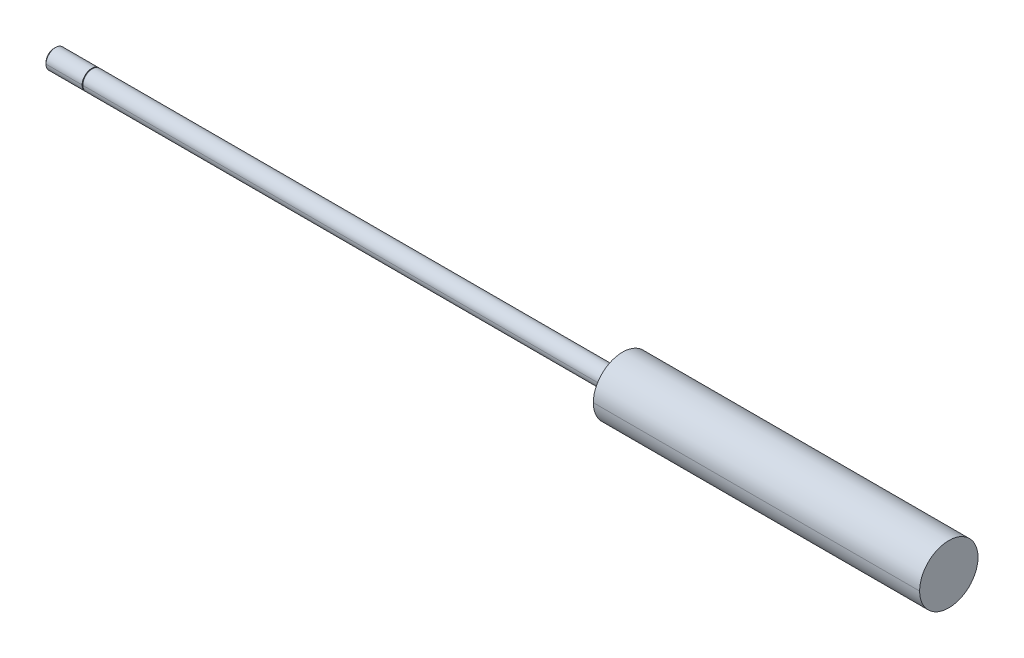
ISO-10303-21;
HEADER;
FILE_DESCRIPTION(('STEP AP214'),'2;1');
FILE_NAME('part.step','',(''),(''),'','','');
FILE_SCHEMA(('AUTOMOTIVE_DESIGN { 1 0 10303 214 1 1 1 1 }'));
ENDSEC;
DATA;
#1=APPLICATION_CONTEXT('core data for automotive mechanical design processes');
#2=APPLICATION_PROTOCOL_DEFINITION('international standard','automotive_design',2000,#1);
#3=PRODUCT_CONTEXT('',#1,'mechanical');
#4=PRODUCT('Part','Part','',(#3));
#5=PRODUCT_RELATED_PRODUCT_CATEGORY('part','',(#4));
#6=PRODUCT_DEFINITION_FORMATION('','',#4);
#7=PRODUCT_DEFINITION_CONTEXT('part definition',#1,'design');
#8=PRODUCT_DEFINITION('design','',#6,#7);
#9=PRODUCT_DEFINITION_SHAPE('','',#8);
#10=(LENGTH_UNIT() NAMED_UNIT(*) SI_UNIT(.MILLI.,.METRE.));
#11=(NAMED_UNIT(*) PLANE_ANGLE_UNIT() SI_UNIT($,.RADIAN.));
#12=(NAMED_UNIT(*) SI_UNIT($,.STERADIAN.) SOLID_ANGLE_UNIT());
#13=UNCERTAINTY_MEASURE_WITH_UNIT(LENGTH_MEASURE(1.E-05),#10,'distance_accuracy_value','');
#14=(GEOMETRIC_REPRESENTATION_CONTEXT(3) GLOBAL_UNCERTAINTY_ASSIGNED_CONTEXT((#13)) GLOBAL_UNIT_ASSIGNED_CONTEXT((#10,
#11,#12)) REPRESENTATION_CONTEXT('',''));
#15=CARTESIAN_POINT('',(0.,0.,0.));
#16=DIRECTION('',(0.,0.,1.));
#17=DIRECTION('',(1.,0.,0.));
#18=AXIS2_PLACEMENT_3D('',#15,#16,#17);
#19=CARTESIAN_POINT('',(0.,0.,0.));
#20=DIRECTION('',(-1.,0.,0.));
#21=DIRECTION('',(0.,-1.,0.));
#22=AXIS2_PLACEMENT_3D('',#19,#20,#21);
#23=CYLINDRICAL_SURFACE('',#22,2.921);
#24=CARTESIAN_POINT('',(0.,0.,0.));
#25=DIRECTION('',(1.,0.,0.));
#26=DIRECTION('',(0.,0.,-1.));
#27=AXIS2_PLACEMENT_3D('',#24,#25,#26);
#28=CIRCLE('',#27,2.921);
#29=CARTESIAN_POINT('',(0.,0.,-2.921));
#30=VERTEX_POINT('',#29);
#31=CARTESIAN_POINT('',(0.,0.,2.921));
#32=VERTEX_POINT('',#31);
#33=EDGE_CURVE('E11',#30,#32,#28,.T.);
#34=ORIENTED_EDGE('',*,*,#33,.F.);
#35=DIRECTION('',(-1.,0.,0.));
#36=VECTOR('',#35,1.);
#37=CARTESIAN_POINT('',(0.,0.,-2.921));
#38=LINE('',#37,#36);
#39=CARTESIAN_POINT('',(-0.254,0.,-2.921));
#40=VERTEX_POINT('',#39);
#41=EDGE_CURVE('E25',#30,#40,#38,.T.);
#42=ORIENTED_EDGE('',*,*,#41,.T.);
#43=CARTESIAN_POINT('',(-0.254,0.,0.));
#44=DIRECTION('',(1.,0.,0.));
#45=DIRECTION('',(0.,0.,-1.));
#46=AXIS2_PLACEMENT_3D('',#43,#44,#45);
#47=CIRCLE('',#46,2.921);
#48=CARTESIAN_POINT('',(-0.254,0.,2.921));
#49=VERTEX_POINT('',#48);
#50=EDGE_CURVE('E211',#40,#49,#47,.T.);
#51=ORIENTED_EDGE('',*,*,#50,.T.);
#52=DIRECTION('',(-1.,0.,0.));
#53=VECTOR('',#52,1.);
#54=CARTESIAN_POINT('',(0.,0.,2.921));
#55=LINE('',#54,#53);
#56=EDGE_CURVE('E206',#32,#49,#55,.T.);
#57=ORIENTED_EDGE('',*,*,#56,.F.);
#58=EDGE_LOOP('',(#34,#42,#51,#57));
#59=FACE_BOUND('',#58,.T.);
#60=ADVANCED_FACE('F17',(#59),#23,.T.);
#61=CARTESIAN_POINT('',(0.,0.,0.));
#62=DIRECTION('',(-1.,0.,0.));
#63=DIRECTION('',(0.,1.,0.));
#64=AXIS2_PLACEMENT_3D('',#61,#62,#63);
#65=CYLINDRICAL_SURFACE('',#64,2.921);
#66=CARTESIAN_POINT('',(-0.254,0.,0.));
#67=DIRECTION('',(1.,0.,0.));
#68=DIRECTION('',(0.,0.,-1.));
#69=AXIS2_PLACEMENT_3D('',#66,#67,#68);
#70=CIRCLE('',#69,2.921);
#71=EDGE_CURVE('E202',#49,#40,#70,.T.);
#72=ORIENTED_EDGE('',*,*,#71,.T.);
#73=ORIENTED_EDGE('',*,*,#41,.F.);
#74=CARTESIAN_POINT('',(0.,0.,0.));
#75=DIRECTION('',(1.,0.,0.));
#76=DIRECTION('',(0.,0.,-1.));
#77=AXIS2_PLACEMENT_3D('',#74,#75,#76);
#78=CIRCLE('',#77,2.921);
#79=EDGE_CURVE('E197',#32,#30,#78,.T.);
#80=ORIENTED_EDGE('',*,*,#79,.F.);
#81=ORIENTED_EDGE('',*,*,#56,.T.);
#82=EDGE_LOOP('',(#72,#73,#80,#81));
#83=FACE_BOUND('',#82,.T.);
#84=ADVANCED_FACE('F224',(#83),#65,.T.);
#85=CARTESIAN_POINT('',(0.,2.921,0.));
#86=DIRECTION('',(1.,0.,0.));
#87=DIRECTION('',(0.,0.,-1.));
#88=AXIS2_PLACEMENT_3D('',#85,#86,#87);
#89=PLANE('',#88);
#90=CARTESIAN_POINT('',(0.,0.,0.));
#91=DIRECTION('',(1.,0.,0.));
#92=DIRECTION('',(0.,0.,-1.));
#93=AXIS2_PLACEMENT_3D('',#90,#91,#92);
#94=CIRCLE('',#93,3.175);
#95=CARTESIAN_POINT('',(0.,0.,-3.175));
#96=VERTEX_POINT('',#95);
#97=CARTESIAN_POINT('',(0.,0.,3.175));
#98=VERTEX_POINT('',#97);
#99=EDGE_CURVE('E192',#96,#98,#94,.T.);
#100=ORIENTED_EDGE('',*,*,#99,.F.);
#101=CARTESIAN_POINT('',(0.,0.,0.));
#102=DIRECTION('',(1.,0.,0.));
#103=DIRECTION('',(0.,0.,-1.));
#104=AXIS2_PLACEMENT_3D('',#101,#102,#103);
#105=CIRCLE('',#104,3.175);
#106=EDGE_CURVE('E187',#98,#96,#105,.T.);
#107=ORIENTED_EDGE('',*,*,#106,.F.);
#108=EDGE_LOOP('',(#100,#107));
#109=FACE_BOUND('',#108,.T.);
#110=ORIENTED_EDGE('',*,*,#33,.T.);
#111=ORIENTED_EDGE('',*,*,#79,.T.);
#112=EDGE_LOOP('',(#110,#111));
#113=FACE_BOUND('',#112,.T.);
#114=ADVANCED_FACE('F249',(#109,#113),#89,.F.);
#115=CARTESIAN_POINT('',(282.1432,0.,0.));
#116=DIRECTION('',(-1.,0.,0.));
#117=DIRECTION('',(0.,1.,0.));
#118=AXIS2_PLACEMENT_3D('',#115,#116,#117);
#119=CYLINDRICAL_SURFACE('',#118,3.175);
#120=ORIENTED_EDGE('',*,*,#106,.T.);
#121=DIRECTION('',(-1.,0.,0.));
#122=VECTOR('',#121,1.);
#123=CARTESIAN_POINT('',(174.625,0.,-3.175));
#124=LINE('',#123,#122);
#125=CARTESIAN_POINT('',(174.625,0.,-3.175));
#126=VERTEX_POINT('',#125);
#127=EDGE_CURVE('E182',#126,#96,#124,.T.);
#128=ORIENTED_EDGE('',*,*,#127,.F.);
#129=CARTESIAN_POINT('',(174.625,0.,0.));
#130=DIRECTION('',(1.,0.,0.));
#131=DIRECTION('',(0.,0.,-1.));
#132=AXIS2_PLACEMENT_3D('',#129,#130,#131);
#133=CIRCLE('',#132,3.175);
#134=CARTESIAN_POINT('',(174.625,0.,3.175));
#135=VERTEX_POINT('',#134);
#136=EDGE_CURVE('E177',#135,#126,#133,.T.);
#137=ORIENTED_EDGE('',*,*,#136,.F.);
#138=DIRECTION('',(-1.,0.,0.));
#139=VECTOR('',#138,1.);
#140=CARTESIAN_POINT('',(174.625,0.,3.175));
#141=LINE('',#140,#139);
#142=EDGE_CURVE('E172',#135,#98,#141,.T.);
#143=ORIENTED_EDGE('',*,*,#142,.T.);
#144=EDGE_LOOP('',(#120,#128,#137,#143));
#145=FACE_BOUND('',#144,.T.);
#146=ADVANCED_FACE('F253',(#145),#119,.T.);
#147=CARTESIAN_POINT('',(282.1432,0.,0.));
#148=DIRECTION('',(-1.,0.,0.));
#149=DIRECTION('',(0.,-1.,0.));
#150=AXIS2_PLACEMENT_3D('',#147,#148,#149);
#151=CYLINDRICAL_SURFACE('',#150,3.175);
#152=CARTESIAN_POINT('',(174.625,0.,0.));
#153=DIRECTION('',(1.,0.,0.));
#154=DIRECTION('',(0.,0.,-1.));
#155=AXIS2_PLACEMENT_3D('',#152,#153,#154);
#156=CIRCLE('',#155,3.175);
#157=EDGE_CURVE('E167',#126,#135,#156,.T.);
#158=ORIENTED_EDGE('',*,*,#157,.F.);
#159=ORIENTED_EDGE('',*,*,#127,.T.);
#160=ORIENTED_EDGE('',*,*,#99,.T.);
#161=ORIENTED_EDGE('',*,*,#142,.F.);
#162=EDGE_LOOP('',(#158,#159,#160,#161));
#163=FACE_BOUND('',#162,.T.);
#164=ADVANCED_FACE('F259',(#163),#151,.T.);
#165=CARTESIAN_POINT('',(174.625,3.175,0.));
#166=DIRECTION('',(1.,0.,0.));
#167=DIRECTION('',(0.,0.,-1.));
#168=AXIS2_PLACEMENT_3D('',#165,#166,#167);
#169=PLANE('',#168);
#170=CARTESIAN_POINT('',(174.625,0.,0.));
#171=DIRECTION('',(1.,0.,0.));
#172=DIRECTION('',(0.,0.,-1.));
#173=AXIS2_PLACEMENT_3D('',#170,#171,#172);
#174=CIRCLE('',#173,9.62025);
#175=CARTESIAN_POINT('',(174.625,0.,-9.62025));
#176=VERTEX_POINT('',#175);
#177=CARTESIAN_POINT('',(174.625,0.,9.62025));
#178=VERTEX_POINT('',#177);
#179=EDGE_CURVE('E162',#176,#178,#174,.T.);
#180=ORIENTED_EDGE('',*,*,#179,.F.);
#181=CARTESIAN_POINT('',(174.625,0.,0.));
#182=DIRECTION('',(1.,0.,0.));
#183=DIRECTION('',(0.,0.,-1.));
#184=AXIS2_PLACEMENT_3D('',#181,#182,#183);
#185=CIRCLE('',#184,9.62025);
#186=EDGE_CURVE('E157',#178,#176,#185,.T.);
#187=ORIENTED_EDGE('',*,*,#186,.F.);
#188=EDGE_LOOP('',(#180,#187));
#189=FACE_BOUND('',#188,.T.);
#190=ORIENTED_EDGE('',*,*,#157,.T.);
#191=ORIENTED_EDGE('',*,*,#136,.T.);
#192=EDGE_LOOP('',(#190,#191));
#193=FACE_BOUND('',#192,.T.);
#194=ADVANCED_FACE('F263',(#189,#193),#169,.F.);
#195=CARTESIAN_POINT('',(282.1432,0.,0.));
#196=DIRECTION('',(-1.,0.,0.));
#197=DIRECTION('',(0.,1.,0.));
#198=AXIS2_PLACEMENT_3D('',#195,#196,#197);
#199=CYLINDRICAL_SURFACE('',#198,9.62025);
#200=ORIENTED_EDGE('',*,*,#186,.T.);
#201=DIRECTION('',(-1.,0.,0.));
#202=VECTOR('',#201,1.);
#203=CARTESIAN_POINT('',(282.1432,0.,-9.62025));
#204=LINE('',#203,#202);
#205=CARTESIAN_POINT('',(282.1432,0.,-9.62025));
#206=VERTEX_POINT('',#205);
#207=EDGE_CURVE('E152',#206,#176,#204,.T.);
#208=ORIENTED_EDGE('',*,*,#207,.F.);
#209=CARTESIAN_POINT('',(282.1432,0.,0.));
#210=DIRECTION('',(1.,0.,0.));
#211=DIRECTION('',(0.,0.,-1.));
#212=AXIS2_PLACEMENT_3D('',#209,#210,#211);
#213=CIRCLE('',#212,9.62025);
#214=CARTESIAN_POINT('',(282.1432,0.,9.62025));
#215=VERTEX_POINT('',#214);
#216=EDGE_CURVE('E147',#215,#206,#213,.T.);
#217=ORIENTED_EDGE('',*,*,#216,.F.);
#218=DIRECTION('',(-1.,0.,0.));
#219=VECTOR('',#218,1.);
#220=CARTESIAN_POINT('',(282.1432,0.,9.62025));
#221=LINE('',#220,#219);
#222=EDGE_CURVE('E142',#215,#178,#221,.T.);
#223=ORIENTED_EDGE('',*,*,#222,.T.);
#224=EDGE_LOOP('',(#200,#208,#217,#223));
#225=FACE_BOUND('',#224,.T.);
#226=ADVANCED_FACE('F267',(#225),#199,.T.);
#227=CARTESIAN_POINT('',(282.1432,0.,0.));
#228=DIRECTION('',(-1.,0.,0.));
#229=DIRECTION('',(0.,-1.,0.));
#230=AXIS2_PLACEMENT_3D('',#227,#228,#229);
#231=CYLINDRICAL_SURFACE('',#230,9.62025);
#232=CARTESIAN_POINT('',(282.1432,0.,0.));
#233=DIRECTION('',(1.,0.,0.));
#234=DIRECTION('',(0.,0.,-1.));
#235=AXIS2_PLACEMENT_3D('',#232,#233,#234);
#236=CIRCLE('',#235,9.62025);
#237=EDGE_CURVE('E137',#206,#215,#236,.T.);
#238=ORIENTED_EDGE('',*,*,#237,.F.);
#239=ORIENTED_EDGE('',*,*,#207,.T.);
#240=ORIENTED_EDGE('',*,*,#179,.T.);
#241=ORIENTED_EDGE('',*,*,#222,.F.);
#242=EDGE_LOOP('',(#238,#239,#240,#241));
#243=FACE_BOUND('',#242,.T.);
#244=ADVANCED_FACE('F271',(#243),#231,.T.);
#245=CARTESIAN_POINT('',(282.1432,9.62025,0.));
#246=DIRECTION('',(-1.,0.,0.));
#247=DIRECTION('',(0.,0.,1.));
#248=AXIS2_PLACEMENT_3D('',#245,#246,#247);
#249=PLANE('',#248);
#250=ORIENTED_EDGE('',*,*,#237,.T.);
#251=ORIENTED_EDGE('',*,*,#216,.T.);
#252=EDGE_LOOP('',(#250,#251));
#253=FACE_BOUND('',#252,.T.);
#254=ADVANCED_FACE('F229',(#253),#249,.F.);
#255=CARTESIAN_POINT('',(-0.254,3.429,0.));
#256=DIRECTION('',(-1.,0.,0.));
#257=DIRECTION('',(0.,0.,1.));
#258=AXIS2_PLACEMENT_3D('',#255,#256,#257);
#259=PLANE('',#258);
#260=ORIENTED_EDGE('',*,*,#50,.F.);
#261=ORIENTED_EDGE('',*,*,#71,.F.);
#262=EDGE_LOOP('',(#260,#261));
#263=FACE_BOUND('',#262,.T.);
#264=CARTESIAN_POINT('',(-0.253999999999976,0.,0.));
#265=DIRECTION('',(-1.,0.,0.));
#266=DIRECTION('',(0.,0.,1.));
#267=AXIS2_PLACEMENT_3D('',#264,#265,#266);
#268=CIRCLE('',#267,3.175);
#269=CARTESIAN_POINT('',(-0.253999999999976,0.,3.175));
#270=VERTEX_POINT('',#269);
#271=CARTESIAN_POINT('',(-0.253999999999962,0.,-3.175));
#272=VERTEX_POINT('',#271);
#273=EDGE_CURVE('E132',#270,#272,#268,.T.);
#274=ORIENTED_EDGE('',*,*,#273,.F.);
#275=CARTESIAN_POINT('',(-0.253999999999976,0.,0.));
#276=DIRECTION('',(-1.,0.,0.));
#277=DIRECTION('',(0.,0.,1.));
#278=AXIS2_PLACEMENT_3D('',#275,#276,#277);
#279=CIRCLE('',#278,3.175);
#280=EDGE_CURVE('E127',#272,#270,#279,.T.);
#281=ORIENTED_EDGE('',*,*,#280,.F.);
#282=EDGE_LOOP('',(#274,#281));
#283=FACE_BOUND('',#282,.T.);
#284=ADVANCED_FACE('F225',(#263,#283),#259,.F.);
#285=CARTESIAN_POINT('',(282.1432,0.,0.));
#286=DIRECTION('',(-1.,0.,0.));
#287=DIRECTION('',(0.,1.,0.));
#288=AXIS2_PLACEMENT_3D('',#285,#286,#287);
#289=CYLINDRICAL_SURFACE('',#288,3.175);
#290=CARTESIAN_POINT('',(-12.15898,0.,0.));
#291=DIRECTION('',(1.,0.,0.));
#292=DIRECTION('',(0.,0.,-1.));
#293=AXIS2_PLACEMENT_3D('',#290,#291,#292);
#294=CIRCLE('',#293,3.175);
#295=CARTESIAN_POINT('',(-12.15898,0.,3.175));
#296=VERTEX_POINT('',#295);
#297=CARTESIAN_POINT('',(-12.15898,0.,-3.175));
#298=VERTEX_POINT('',#297);
#299=EDGE_CURVE('E98',#296,#298,#294,.T.);
#300=ORIENTED_EDGE('',*,*,#299,.T.);
#301=DIRECTION('',(-1.,0.,0.));
#302=VECTOR('',#301,1.);
#303=CARTESIAN_POINT('',(-0.253999999999962,0.,-3.175));
#304=LINE('',#303,#302);
#305=EDGE_CURVE('E119',#272,#298,#304,.T.);
#306=ORIENTED_EDGE('',*,*,#305,.F.);
#307=ORIENTED_EDGE('',*,*,#280,.T.);
#308=DIRECTION('',(-1.,0.,0.));
#309=VECTOR('',#308,1.);
#310=CARTESIAN_POINT('',(-0.253999999999962,0.,3.175));
#311=LINE('',#310,#309);
#312=EDGE_CURVE('E115',#270,#296,#311,.T.);
#313=ORIENTED_EDGE('',*,*,#312,.T.);
#314=EDGE_LOOP('',(#300,#306,#307,#313));
#315=FACE_BOUND('',#314,.T.);
#316=ADVANCED_FACE('F228',(#315),#289,.T.);
#317=CARTESIAN_POINT('',(282.1432,0.,0.));
#318=DIRECTION('',(-1.,0.,0.));
#319=DIRECTION('',(0.,-1.,0.));
#320=AXIS2_PLACEMENT_3D('',#317,#318,#319);
#321=CYLINDRICAL_SURFACE('',#320,3.175);
#322=ORIENTED_EDGE('',*,*,#273,.T.);
#323=ORIENTED_EDGE('',*,*,#305,.T.);
#324=CARTESIAN_POINT('',(-12.15898,0.,0.));
#325=DIRECTION('',(1.,0.,0.));
#326=DIRECTION('',(0.,0.,-1.));
#327=AXIS2_PLACEMENT_3D('',#324,#325,#326);
#328=CIRCLE('',#327,3.175);
#329=EDGE_CURVE('E110',#298,#296,#328,.T.);
#330=ORIENTED_EDGE('',*,*,#329,.T.);
#331=ORIENTED_EDGE('',*,*,#312,.F.);
#332=EDGE_LOOP('',(#322,#323,#330,#331));
#333=FACE_BOUND('',#332,.T.);
#334=ADVANCED_FACE('F235',(#333),#321,.T.);
#335=CARTESIAN_POINT('',(-12.7,0.,0.));
#336=DIRECTION('',(1.,0.,0.));
#337=DIRECTION('',(0.,-1.,0.));
#338=AXIS2_PLACEMENT_3D('',#335,#336,#337);
#339=CONICAL_SURFACE('',#338,2.63398,0.7853981634);
#340=ORIENTED_EDGE('',*,*,#329,.F.);
#341=DIRECTION('',(0.707106781184742,0.,-0.707106781188353));
#342=VECTOR('',#341,1.);
#343=CARTESIAN_POINT('',(-12.7,0.,-2.63398));
#344=LINE('',#343,#342);
#345=CARTESIAN_POINT('',(-12.7,0.,-2.63398));
#346=VERTEX_POINT('',#345);
#347=EDGE_CURVE('E90',#346,#298,#344,.T.);
#348=ORIENTED_EDGE('',*,*,#347,.F.);
#349=CARTESIAN_POINT('',(-12.7,0.,0.));
#350=DIRECTION('',(1.,0.,0.));
#351=DIRECTION('',(0.,0.,-1.));
#352=AXIS2_PLACEMENT_3D('',#349,#350,#351);
#353=CIRCLE('',#352,2.63398);
#354=CARTESIAN_POINT('',(-12.7,0.,2.63398));
#355=VERTEX_POINT('',#354);
#356=EDGE_CURVE('E83',#346,#355,#353,.T.);
#357=ORIENTED_EDGE('',*,*,#356,.T.);
#358=DIRECTION('',(0.707106781184742,0.,0.707106781188353));
#359=VECTOR('',#358,1.);
#360=CARTESIAN_POINT('',(-12.7,0.,2.63398));
#361=LINE('',#360,#359);
#362=EDGE_CURVE('E87',#355,#296,#361,.T.);
#363=ORIENTED_EDGE('',*,*,#362,.T.);
#364=EDGE_LOOP('',(#340,#348,#357,#363));
#365=FACE_BOUND('',#364,.T.);
#366=ADVANCED_FACE('F86',(#365),#339,.T.);
#367=CARTESIAN_POINT('',(-12.7,0.,0.));
#368=DIRECTION('',(1.,0.,0.));
#369=DIRECTION('',(0.,1.,0.));
#370=AXIS2_PLACEMENT_3D('',#367,#368,#369);
#371=CONICAL_SURFACE('',#370,2.63398,0.7853981634);
#372=CARTESIAN_POINT('',(-12.7,0.,0.));
#373=DIRECTION('',(1.,0.,0.));
#374=DIRECTION('',(0.,0.,-1.));
#375=AXIS2_PLACEMENT_3D('',#372,#373,#374);
#376=CIRCLE('',#375,2.63398);
#377=EDGE_CURVE('E97',#355,#346,#376,.T.);
#378=ORIENTED_EDGE('',*,*,#377,.T.);
#379=ORIENTED_EDGE('',*,*,#347,.T.);
#380=ORIENTED_EDGE('',*,*,#299,.F.);
#381=ORIENTED_EDGE('',*,*,#362,.F.);
#382=EDGE_LOOP('',(#378,#379,#380,#381));
#383=FACE_BOUND('',#382,.T.);
#384=ADVANCED_FACE('F96',(#383),#371,.T.);
#385=CARTESIAN_POINT('',(-12.7,0.,0.));
#386=DIRECTION('',(1.,0.,0.));
#387=DIRECTION('',(0.,0.,-1.));
#388=AXIS2_PLACEMENT_3D('',#385,#386,#387);
#389=PLANE('',#388);
#390=ORIENTED_EDGE('',*,*,#356,.F.);
#391=ORIENTED_EDGE('',*,*,#377,.F.);
#392=EDGE_LOOP('',(#390,#391));
#393=FACE_BOUND('',#392,.T.);
#394=ADVANCED_FACE('F100',(#393),#389,.F.);
#395=CLOSED_SHELL('',(#60,#84,#114,#146,#164,#194,#226,#244,#254,#284,#316,#334,#366,#384,#394));
#396=MANIFOLD_SOLID_BREP('B1',#395);
#397=ADVANCED_BREP_SHAPE_REPRESENTATION('',(#18,#396),#14);
#398=SHAPE_DEFINITION_REPRESENTATION(#9,#397);
ENDSEC;
END-ISO-10303-21;
